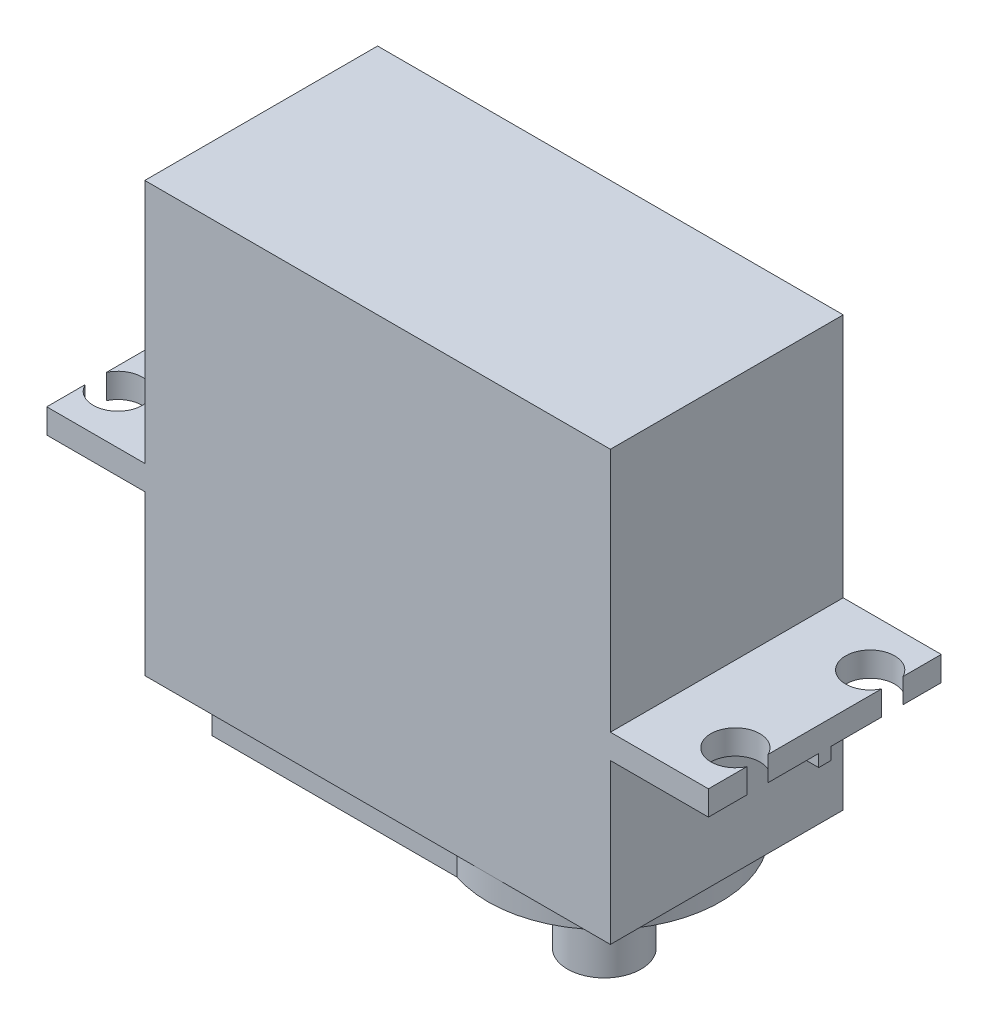
ISO-10303-21;
HEADER;
FILE_DESCRIPTION(('STEP AP214'),'2;1');
FILE_NAME('part.step','',(''),(''),'','','');
FILE_SCHEMA(('AUTOMOTIVE_DESIGN { 1 0 10303 214 1 1 1 1 }'));
ENDSEC;
DATA;
#1=APPLICATION_CONTEXT('core data for automotive mechanical design processes');
#2=APPLICATION_PROTOCOL_DEFINITION('international standard','automotive_design',2000,#1);
#3=PRODUCT_CONTEXT('',#1,'mechanical');
#4=PRODUCT('Part','Part','',(#3));
#5=PRODUCT_RELATED_PRODUCT_CATEGORY('part','',(#4));
#6=PRODUCT_DEFINITION_FORMATION('','',#4);
#7=PRODUCT_DEFINITION_CONTEXT('part definition',#1,'design');
#8=PRODUCT_DEFINITION('design','',#6,#7);
#9=PRODUCT_DEFINITION_SHAPE('','',#8);
#10=(LENGTH_UNIT() NAMED_UNIT(*) SI_UNIT(.MILLI.,.METRE.));
#11=(NAMED_UNIT(*) PLANE_ANGLE_UNIT() SI_UNIT($,.RADIAN.));
#12=(NAMED_UNIT(*) SI_UNIT($,.STERADIAN.) SOLID_ANGLE_UNIT());
#13=UNCERTAINTY_MEASURE_WITH_UNIT(LENGTH_MEASURE(1.E-05),#10,'distance_accuracy_value','');
#14=(GEOMETRIC_REPRESENTATION_CONTEXT(3) GLOBAL_UNCERTAINTY_ASSIGNED_CONTEXT((#13)) GLOBAL_UNIT_ASSIGNED_CONTEXT((#10,
#11,#12)) REPRESENTATION_CONTEXT('',''));
#15=CARTESIAN_POINT('',(0.,0.,0.));
#16=DIRECTION('',(0.,0.,1.));
#17=DIRECTION('',(1.,0.,0.));
#18=AXIS2_PLACEMENT_3D('',#15,#16,#17);
#19=CARTESIAN_POINT('',(9.,-10.,9.5));
#20=DIRECTION('',(0.,1.,0.));
#21=DIRECTION('',(0.,0.,1.));
#22=AXIS2_PLACEMENT_3D('',#19,#20,#21);
#23=CYLINDRICAL_SURFACE('',#22,3.);
#24=CARTESIAN_POINT('',(9.,-10.,9.5));
#25=DIRECTION('',(0.,-1.,0.));
#26=DIRECTION('',(0.,0.,-1.));
#27=AXIS2_PLACEMENT_3D('',#24,#25,#26);
#28=CIRCLE('',#27,3.);
#29=CARTESIAN_POINT('',(9.,-10.,6.5));
#30=VERTEX_POINT('',#29);
#31=EDGE_CURVE('E11',#30,#30,#28,.T.);
#32=ORIENTED_EDGE('',*,*,#31,.F.);
#33=EDGE_LOOP('',(#32));
#34=FACE_BOUND('',#33,.T.);
#35=CARTESIAN_POINT('',(9.,-2.,9.5));
#36=DIRECTION('',(0.,-1.,0.));
#37=DIRECTION('',(0.,0.,-1.));
#38=AXIS2_PLACEMENT_3D('',#35,#36,#37);
#39=CIRCLE('',#38,3.);
#40=CARTESIAN_POINT('',(9.,-2.,6.5));
#41=VERTEX_POINT('',#40);
#42=EDGE_CURVE('E52',#41,#41,#39,.T.);
#43=ORIENTED_EDGE('',*,*,#42,.T.);
#44=EDGE_LOOP('',(#43));
#45=FACE_BOUND('',#44,.T.);
#46=ADVANCED_FACE('F49',(#34,#45),#23,.T.);
#47=CARTESIAN_POINT('',(9.,-10.,9.5));
#48=DIRECTION('',(0.,-1.,0.));
#49=DIRECTION('',(0.,0.,-1.));
#50=AXIS2_PLACEMENT_3D('',#47,#48,#49);
#51=PLANE('',#50);
#52=ORIENTED_EDGE('',*,*,#31,.T.);
#53=EDGE_LOOP('',(#52));
#54=FACE_BOUND('',#53,.T.);
#55=ADVANCED_FACE('F64',(#54),#51,.T.);
#56=CARTESIAN_POINT('',(9.,-2.,9.5));
#57=DIRECTION('',(0.,-1.,0.));
#58=DIRECTION('',(0.,0.,-1.));
#59=AXIS2_PLACEMENT_3D('',#56,#57,#58);
#60=PLANE('',#59);
#61=ORIENTED_EDGE('',*,*,#42,.F.);
#62=EDGE_LOOP('',(#61));
#63=FACE_BOUND('',#62,.T.);
#64=ADVANCED_FACE('F62',(#63),#60,.F.);
#65=CLOSED_SHELL('',(#46,#55,#64));
#66=MANIFOLD_SOLID_BREP('B2',#65);
#67=CARTESIAN_POINT('',(19.,0.,19.));
#68=DIRECTION('',(0.,1.,0.));
#69=DIRECTION('',(0.,0.,1.));
#70=AXIS2_PLACEMENT_3D('',#67,#68,#69);
#71=PLANE('',#70);
#72=DIRECTION('',(1.,0.,0.));
#73=VECTOR('',#72,1.);
#74=CARTESIAN_POINT('',(19.,0.,0.));
#75=LINE('',#74,#73);
#76=CARTESIAN_POINT('',(-19.,0.,0.));
#77=VERTEX_POINT('',#76);
#78=CARTESIAN_POINT('',(19.,0.,0.));
#79=VERTEX_POINT('',#78);
#80=EDGE_CURVE('E513',#77,#79,#75,.T.);
#81=ORIENTED_EDGE('',*,*,#80,.T.);
#82=DIRECTION('',(0.,0.,-1.));
#83=VECTOR('',#82,1.);
#84=CARTESIAN_POINT('',(19.,0.,19.));
#85=LINE('',#84,#83);
#86=CARTESIAN_POINT('',(19.,0.,19.));
#87=VERTEX_POINT('',#86);
#88=EDGE_CURVE('E564',#87,#79,#85,.T.);
#89=ORIENTED_EDGE('',*,*,#88,.F.);
#90=DIRECTION('',(1.,0.,0.));
#91=VECTOR('',#90,1.);
#92=CARTESIAN_POINT('',(19.,0.,19.));
#93=LINE('',#92,#91);
#94=CARTESIAN_POINT('',(-19.,0.,19.));
#95=VERTEX_POINT('',#94);
#96=EDGE_CURVE('E473',#95,#87,#93,.T.);
#97=ORIENTED_EDGE('',*,*,#96,.F.);
#98=DIRECTION('',(0.,0.,-1.));
#99=VECTOR('',#98,1.);
#100=CARTESIAN_POINT('',(-19.,0.,19.));
#101=LINE('',#100,#99);
#102=EDGE_CURVE('E568',#95,#77,#101,.T.);
#103=ORIENTED_EDGE('',*,*,#102,.T.);
#104=EDGE_LOOP('',(#81,#89,#97,#103));
#105=FACE_BOUND('',#104,.T.);
#106=DIRECTION('',(0.,0.,-1.));
#107=VECTOR('',#106,1.);
#108=CARTESIAN_POINT('',(-14.,0.,18.5));
#109=LINE('',#108,#107);
#110=CARTESIAN_POINT('',(-14.,0.,18.5));
#111=VERTEX_POINT('',#110);
#112=CARTESIAN_POINT('',(-14.,0.,0.5));
#113=VERTEX_POINT('',#112);
#114=EDGE_CURVE('E322',#111,#113,#109,.T.);
#115=ORIENTED_EDGE('',*,*,#114,.F.);
#116=DIRECTION('',(-1.,0.,0.));
#117=VECTOR('',#116,1.);
#118=CARTESIAN_POINT('',(-14.,0.,18.5));
#119=LINE('',#118,#117);
#120=CARTESIAN_POINT('',(6.,0.,18.5));
#121=VERTEX_POINT('',#120);
#122=EDGE_CURVE('E319',#121,#111,#119,.T.);
#123=ORIENTED_EDGE('',*,*,#122,.F.);
#124=CARTESIAN_POINT('',(9.,0.,9.5));
#125=DIRECTION('',(0.,-1.,0.));
#126=DIRECTION('',(0.,0.,1.));
#127=AXIS2_PLACEMENT_3D('',#124,#125,#126);
#128=CIRCLE('',#127,9.48683298050514);
#129=CARTESIAN_POINT('',(6.,0.,0.5));
#130=VERTEX_POINT('',#129);
#131=EDGE_CURVE('E111',#130,#121,#128,.T.);
#132=ORIENTED_EDGE('',*,*,#131,.F.);
#133=DIRECTION('',(1.,0.,0.));
#134=VECTOR('',#133,1.);
#135=CARTESIAN_POINT('',(-14.,0.,0.5));
#136=LINE('',#135,#134);
#137=EDGE_CURVE('E106',#113,#130,#136,.T.);
#138=ORIENTED_EDGE('',*,*,#137,.F.);
#139=EDGE_LOOP('',(#115,#123,#132,#138));
#140=FACE_BOUND('',#139,.T.);
#141=ADVANCED_FACE('F90',(#105,#140),#71,.F.);
#142=CARTESIAN_POINT('',(19.,0.,19.));
#143=DIRECTION('',(-1.,0.,0.));
#144=DIRECTION('',(0.,0.,1.));
#145=AXIS2_PLACEMENT_3D('',#142,#143,#144);
#146=PLANE('',#145);
#147=DIRECTION('',(0.,1.,0.));
#148=VECTOR('',#147,1.);
#149=CARTESIAN_POINT('',(19.,12.,8.99999999999999));
#150=LINE('',#149,#148);
#151=CARTESIAN_POINT('',(19.,12.,8.99999999999999));
#152=VERTEX_POINT('',#151);
#153=CARTESIAN_POINT('',(19.,13.,8.99999999999999));
#154=VERTEX_POINT('',#153);
#155=EDGE_CURVE('E364',#152,#154,#150,.T.);
#156=ORIENTED_EDGE('',*,*,#155,.F.);
#157=DIRECTION('',(0.,0.,-1.));
#158=VECTOR('',#157,1.);
#159=CARTESIAN_POINT('',(19.,12.,9.99999999999999));
#160=LINE('',#159,#158);
#161=CARTESIAN_POINT('',(19.,12.,9.99999999999999));
#162=VERTEX_POINT('',#161);
#163=EDGE_CURVE('E335',#162,#152,#160,.T.);
#164=ORIENTED_EDGE('',*,*,#163,.F.);
#165=DIRECTION('',(0.,1.,0.));
#166=VECTOR('',#165,1.);
#167=CARTESIAN_POINT('',(19.,12.,9.99999999999999));
#168=LINE('',#167,#166);
#169=CARTESIAN_POINT('',(19.,13.,9.99999999999999));
#170=VERTEX_POINT('',#169);
#171=EDGE_CURVE('E348',#162,#170,#168,.T.);
#172=ORIENTED_EDGE('',*,*,#171,.T.);
#173=DIRECTION('',(0.,0.,-1.));
#174=VECTOR('',#173,1.);
#175=CARTESIAN_POINT('',(19.,13.,19.));
#176=LINE('',#175,#174);
#177=CARTESIAN_POINT('',(19.,13.,19.));
#178=VERTEX_POINT('',#177);
#179=EDGE_CURVE('E561',#178,#170,#176,.T.);
#180=ORIENTED_EDGE('',*,*,#179,.F.);
#181=DIRECTION('',(0.,1.,0.));
#182=VECTOR('',#181,1.);
#183=CARTESIAN_POINT('',(19.,0.,19.));
#184=LINE('',#183,#182);
#185=EDGE_CURVE('E476',#87,#178,#184,.T.);
#186=ORIENTED_EDGE('',*,*,#185,.F.);
#187=ORIENTED_EDGE('',*,*,#88,.T.);
#188=DIRECTION('',(0.,1.,0.));
#189=VECTOR('',#188,1.);
#190=CARTESIAN_POINT('',(19.,0.,0.));
#191=LINE('',#190,#189);
#192=CARTESIAN_POINT('',(19.,13.,0.));
#193=VERTEX_POINT('',#192);
#194=EDGE_CURVE('E516',#79,#193,#191,.T.);
#195=ORIENTED_EDGE('',*,*,#194,.T.);
#196=EDGE_CURVE('E558',#154,#193,#176,.T.);
#197=ORIENTED_EDGE('',*,*,#196,.F.);
#198=EDGE_LOOP('',(#156,#164,#172,#180,#186,#187,#195,#197));
#199=FACE_BOUND('',#198,.T.);
#200=ADVANCED_FACE('F697',(#199),#146,.F.);
#201=CARTESIAN_POINT('',(19.,13.,19.));
#202=DIRECTION('',(0.,1.,0.));
#203=DIRECTION('',(-1.,0.,0.));
#204=AXIS2_PLACEMENT_3D('',#201,#202,#203);
#205=PLANE('',#204);
#206=DIRECTION('',(1.,0.,0.));
#207=VECTOR('',#206,1.);
#208=CARTESIAN_POINT('',(19.,13.,8.99999999999999));
#209=LINE('',#208,#207);
#210=CARTESIAN_POINT('',(27.,13.,8.99999999999999));
#211=VERTEX_POINT('',#210);
#212=EDGE_CURVE('E324',#154,#211,#209,.T.);
#213=ORIENTED_EDGE('',*,*,#212,.F.);
#214=ORIENTED_EDGE('',*,*,#196,.T.);
#215=DIRECTION('',(1.,0.,0.));
#216=VECTOR('',#215,1.);
#217=CARTESIAN_POINT('',(19.,13.,0.));
#218=LINE('',#217,#216);
#219=CARTESIAN_POINT('',(27.,13.,0.));
#220=VERTEX_POINT('',#219);
#221=EDGE_CURVE('E520',#193,#220,#218,.T.);
#222=ORIENTED_EDGE('',*,*,#221,.T.);
#223=DIRECTION('',(0.,0.,-1.));
#224=VECTOR('',#223,1.);
#225=CARTESIAN_POINT('',(27.,13.,19.));
#226=LINE('',#225,#224);
#227=CARTESIAN_POINT('',(27.,13.,3.12822021129187));
#228=VERTEX_POINT('',#227);
#229=EDGE_CURVE('E552',#228,#220,#226,.T.);
#230=ORIENTED_EDGE('',*,*,#229,.F.);
#231=CARTESIAN_POINT('',(25.2,13.,4.));
#232=DIRECTION('',(0.,1.,0.));
#233=DIRECTION('',(-1.,0.,0.));
#234=AXIS2_PLACEMENT_3D('',#231,#232,#233);
#235=CIRCLE('',#234,2.);
#236=CARTESIAN_POINT('',(27.,13.,4.87177978870814));
#237=VERTEX_POINT('',#236);
#238=EDGE_CURVE('E419',#228,#237,#235,.T.);
#239=ORIENTED_EDGE('',*,*,#238,.T.);
#240=EDGE_CURVE('E560',#211,#237,#226,.T.);
#241=ORIENTED_EDGE('',*,*,#240,.F.);
#242=EDGE_LOOP('',(#213,#214,#222,#230,#239,#241));
#243=FACE_BOUND('',#242,.T.);
#244=ADVANCED_FACE('F693',(#243),#205,.F.);
#245=DIRECTION('',(-1.,0.,0.));
#246=VECTOR('',#245,1.);
#247=CARTESIAN_POINT('',(19.,13.,9.99999999999999));
#248=LINE('',#247,#246);
#249=CARTESIAN_POINT('',(27.,13.,9.99999999999999));
#250=VERTEX_POINT('',#249);
#251=EDGE_CURVE('E329',#250,#170,#248,.T.);
#252=ORIENTED_EDGE('',*,*,#251,.F.);
#253=CARTESIAN_POINT('',(27.,13.,14.1282202112919));
#254=VERTEX_POINT('',#253);
#255=EDGE_CURVE('E559',#254,#250,#226,.T.);
#256=ORIENTED_EDGE('',*,*,#255,.F.);
#257=CARTESIAN_POINT('',(25.2,13.,15.));
#258=DIRECTION('',(0.,1.,0.));
#259=DIRECTION('',(-1.,0.,0.));
#260=AXIS2_PLACEMENT_3D('',#257,#258,#259);
#261=CIRCLE('',#260,2.);
#262=CARTESIAN_POINT('',(27.,13.,15.8717797887081));
#263=VERTEX_POINT('',#262);
#264=EDGE_CURVE('E447',#254,#263,#261,.T.);
#265=ORIENTED_EDGE('',*,*,#264,.T.);
#266=CARTESIAN_POINT('',(27.,13.,19.));
#267=VERTEX_POINT('',#266);
#268=EDGE_CURVE('E554',#267,#263,#226,.T.);
#269=ORIENTED_EDGE('',*,*,#268,.F.);
#270=DIRECTION('',(1.,0.,0.));
#271=VECTOR('',#270,1.);
#272=CARTESIAN_POINT('',(19.,13.,19.));
#273=LINE('',#272,#271);
#274=EDGE_CURVE('E479',#178,#267,#273,.T.);
#275=ORIENTED_EDGE('',*,*,#274,.F.);
#276=ORIENTED_EDGE('',*,*,#179,.T.);
#277=EDGE_LOOP('',(#252,#256,#265,#269,#275,#276));
#278=FACE_BOUND('',#277,.T.);
#279=ADVANCED_FACE('F702',(#278),#205,.F.);
#280=CARTESIAN_POINT('',(-19.,13.,19.));
#281=DIRECTION('',(0.,1.,0.));
#282=DIRECTION('',(-1.,0.,0.));
#283=AXIS2_PLACEMENT_3D('',#280,#281,#282);
#284=PLANE('',#283);
#285=DIRECTION('',(-1.,0.,0.));
#286=VECTOR('',#285,1.);
#287=CARTESIAN_POINT('',(-19.,13.,10.));
#288=LINE('',#287,#286);
#289=CARTESIAN_POINT('',(-19.,13.,10.));
#290=VERTEX_POINT('',#289);
#291=CARTESIAN_POINT('',(-27.,13.,10.));
#292=VERTEX_POINT('',#291);
#293=EDGE_CURVE('E368',#290,#292,#288,.T.);
#294=ORIENTED_EDGE('',*,*,#293,.F.);
#295=DIRECTION('',(0.,0.,-1.));
#296=VECTOR('',#295,1.);
#297=CARTESIAN_POINT('',(-19.,13.,19.));
#298=LINE('',#297,#296);
#299=CARTESIAN_POINT('',(-19.,13.,19.));
#300=VERTEX_POINT('',#299);
#301=EDGE_CURVE('E573',#300,#290,#298,.T.);
#302=ORIENTED_EDGE('',*,*,#301,.F.);
#303=DIRECTION('',(1.,0.,0.));
#304=VECTOR('',#303,1.);
#305=CARTESIAN_POINT('',(-19.,13.,19.));
#306=LINE('',#305,#304);
#307=CARTESIAN_POINT('',(-27.,13.,19.));
#308=VERTEX_POINT('',#307);
#309=EDGE_CURVE('E467',#308,#300,#306,.T.);
#310=ORIENTED_EDGE('',*,*,#309,.F.);
#311=DIRECTION('',(0.,0.,-1.));
#312=VECTOR('',#311,1.);
#313=CARTESIAN_POINT('',(-27.,13.,19.));
#314=LINE('',#313,#312);
#315=CARTESIAN_POINT('',(-27.,13.,15.8717797887081));
#316=VERTEX_POINT('',#315);
#317=EDGE_CURVE('E578',#308,#316,#314,.T.);
#318=ORIENTED_EDGE('',*,*,#317,.T.);
#319=CARTESIAN_POINT('',(-25.2,13.,15.));
#320=DIRECTION('',(0.,1.,0.));
#321=DIRECTION('',(-1.,0.,0.));
#322=AXIS2_PLACEMENT_3D('',#319,#320,#321);
#323=CIRCLE('',#322,2.);
#324=CARTESIAN_POINT('',(-27.,13.,14.1282202112919));
#325=VERTEX_POINT('',#324);
#326=EDGE_CURVE('E99',#316,#325,#323,.T.);
#327=ORIENTED_EDGE('',*,*,#326,.T.);
#328=EDGE_CURVE('E583',#325,#292,#314,.T.);
#329=ORIENTED_EDGE('',*,*,#328,.T.);
#330=EDGE_LOOP('',(#294,#302,#310,#318,#327,#329));
#331=FACE_BOUND('',#330,.T.);
#332=ADVANCED_FACE('F601',(#331),#284,.F.);
#333=DIRECTION('',(1.,0.,0.));
#334=VECTOR('',#333,1.);
#335=CARTESIAN_POINT('',(-19.,13.,9.));
#336=LINE('',#335,#334);
#337=CARTESIAN_POINT('',(-27.,13.,9.));
#338=VERTEX_POINT('',#337);
#339=CARTESIAN_POINT('',(-19.,13.,9.));
#340=VERTEX_POINT('',#339);
#341=EDGE_CURVE('E374',#338,#340,#336,.T.);
#342=ORIENTED_EDGE('',*,*,#341,.F.);
#343=CARTESIAN_POINT('',(-27.,13.,4.87177978870813));
#344=VERTEX_POINT('',#343);
#345=EDGE_CURVE('E584',#338,#344,#314,.T.);
#346=ORIENTED_EDGE('',*,*,#345,.T.);
#347=CARTESIAN_POINT('',(-25.2,13.,4.));
#348=DIRECTION('',(0.,1.,0.));
#349=DIRECTION('',(-1.,0.,0.));
#350=AXIS2_PLACEMENT_3D('',#347,#348,#349);
#351=CIRCLE('',#350,2.);
#352=CARTESIAN_POINT('',(-27.,13.,3.12822021129187));
#353=VERTEX_POINT('',#352);
#354=EDGE_CURVE('E47',#344,#353,#351,.T.);
#355=ORIENTED_EDGE('',*,*,#354,.T.);
#356=CARTESIAN_POINT('',(-27.,13.,0.));
#357=VERTEX_POINT('',#356);
#358=EDGE_CURVE('E577',#353,#357,#314,.T.);
#359=ORIENTED_EDGE('',*,*,#358,.T.);
#360=DIRECTION('',(1.,0.,0.));
#361=VECTOR('',#360,1.);
#362=CARTESIAN_POINT('',(-19.,13.,0.));
#363=LINE('',#362,#361);
#364=CARTESIAN_POINT('',(-19.,13.,0.));
#365=VERTEX_POINT('',#364);
#366=EDGE_CURVE('E506',#357,#365,#363,.T.);
#367=ORIENTED_EDGE('',*,*,#366,.T.);
#368=EDGE_CURVE('E572',#340,#365,#298,.T.);
#369=ORIENTED_EDGE('',*,*,#368,.F.);
#370=EDGE_LOOP('',(#342,#346,#355,#359,#367,#369));
#371=FACE_BOUND('',#370,.T.);
#372=ADVANCED_FACE('F615',(#371),#284,.F.);
#373=CARTESIAN_POINT('',(-19.,0.,19.));
#374=DIRECTION('',(1.,0.,0.));
#375=DIRECTION('',(0.,0.,-1.));
#376=AXIS2_PLACEMENT_3D('',#373,#374,#375);
#377=PLANE('',#376);
#378=DIRECTION('',(0.,1.,0.));
#379=VECTOR('',#378,1.);
#380=CARTESIAN_POINT('',(-19.,12.,10.));
#381=LINE('',#380,#379);
#382=CARTESIAN_POINT('',(-19.,12.,10.));
#383=VERTEX_POINT('',#382);
#384=EDGE_CURVE('E385',#383,#290,#381,.T.);
#385=ORIENTED_EDGE('',*,*,#384,.F.);
#386=DIRECTION('',(0.,0.,1.));
#387=VECTOR('',#386,1.);
#388=CARTESIAN_POINT('',(-19.,12.,10.));
#389=LINE('',#388,#387);
#390=CARTESIAN_POINT('',(-19.,12.,9.));
#391=VERTEX_POINT('',#390);
#392=EDGE_CURVE('E381',#391,#383,#389,.T.);
#393=ORIENTED_EDGE('',*,*,#392,.F.);
#394=DIRECTION('',(0.,1.,0.));
#395=VECTOR('',#394,1.);
#396=CARTESIAN_POINT('',(-19.,12.,9.));
#397=LINE('',#396,#395);
#398=EDGE_CURVE('E395',#391,#340,#397,.T.);
#399=ORIENTED_EDGE('',*,*,#398,.T.);
#400=ORIENTED_EDGE('',*,*,#368,.T.);
#401=DIRECTION('',(0.,-1.,0.));
#402=VECTOR('',#401,1.);
#403=CARTESIAN_POINT('',(-19.,0.,0.));
#404=LINE('',#403,#402);
#405=EDGE_CURVE('E510',#365,#77,#404,.T.);
#406=ORIENTED_EDGE('',*,*,#405,.T.);
#407=ORIENTED_EDGE('',*,*,#102,.F.);
#408=DIRECTION('',(0.,-1.,0.));
#409=VECTOR('',#408,1.);
#410=CARTESIAN_POINT('',(-19.,0.,19.));
#411=LINE('',#410,#409);
#412=EDGE_CURVE('E470',#300,#95,#411,.T.);
#413=ORIENTED_EDGE('',*,*,#412,.F.);
#414=ORIENTED_EDGE('',*,*,#301,.T.);
#415=EDGE_LOOP('',(#385,#393,#399,#400,#406,#407,#413,#414));
#416=FACE_BOUND('',#415,.T.);
#417=ADVANCED_FACE('F631',(#416),#377,.F.);
#418=CARTESIAN_POINT('',(-27.,13.,19.));
#419=DIRECTION('',(1.,0.,0.));
#420=DIRECTION('',(0.,0.,-1.));
#421=AXIS2_PLACEMENT_3D('',#418,#419,#420);
#422=PLANE('',#421);
#423=ORIENTED_EDGE('',*,*,#358,.F.);
#424=DIRECTION('',(0.,1.,0.));
#425=VECTOR('',#424,1.);
#426=CARTESIAN_POINT('',(-27.,0.,3.12822021129187));
#427=LINE('',#426,#425);
#428=CARTESIAN_POINT('',(-27.,15.,3.12822021129187));
#429=VERTEX_POINT('',#428);
#430=EDGE_CURVE('E439',#353,#429,#427,.T.);
#431=ORIENTED_EDGE('',*,*,#430,.T.);
#432=DIRECTION('',(0.,0.,-1.));
#433=VECTOR('',#432,1.);
#434=CARTESIAN_POINT('',(-27.,15.,19.));
#435=LINE('',#434,#433);
#436=CARTESIAN_POINT('',(-27.,15.,0.));
#437=VERTEX_POINT('',#436);
#438=EDGE_CURVE('E582',#429,#437,#435,.T.);
#439=ORIENTED_EDGE('',*,*,#438,.T.);
#440=DIRECTION('',(0.,-1.,0.));
#441=VECTOR('',#440,1.);
#442=CARTESIAN_POINT('',(-27.,13.,0.));
#443=LINE('',#442,#441);
#444=EDGE_CURVE('E502',#437,#357,#443,.T.);
#445=ORIENTED_EDGE('',*,*,#444,.T.);
#446=EDGE_LOOP('',(#423,#431,#439,#445));
#447=FACE_BOUND('',#446,.T.);
#448=ADVANCED_FACE('F622',(#447),#422,.F.);
#449=CARTESIAN_POINT('',(-27.,15.,14.1282202112919));
#450=VERTEX_POINT('',#449);
#451=CARTESIAN_POINT('',(-27.,15.,4.87177978870813));
#452=VERTEX_POINT('',#451);
#453=EDGE_CURVE('E590',#450,#452,#435,.T.);
#454=ORIENTED_EDGE('',*,*,#453,.T.);
#455=DIRECTION('',(0.,1.,0.));
#456=VECTOR('',#455,1.);
#457=CARTESIAN_POINT('',(-27.,0.,4.87177978870814));
#458=LINE('',#457,#456);
#459=EDGE_CURVE('E435',#452,#344,#458,.F.);
#460=ORIENTED_EDGE('',*,*,#459,.T.);
#461=ORIENTED_EDGE('',*,*,#345,.F.);
#462=DIRECTION('',(0.,1.,0.));
#463=VECTOR('',#462,1.);
#464=CARTESIAN_POINT('',(-27.,12.,9.));
#465=LINE('',#464,#463);
#466=CARTESIAN_POINT('',(-27.,12.,9.));
#467=VERTEX_POINT('',#466);
#468=EDGE_CURVE('E398',#467,#338,#465,.T.);
#469=ORIENTED_EDGE('',*,*,#468,.F.);
#470=DIRECTION('',(0.,0.,-1.));
#471=VECTOR('',#470,1.);
#472=CARTESIAN_POINT('',(-27.,12.,9.));
#473=LINE('',#472,#471);
#474=CARTESIAN_POINT('',(-27.,12.,10.));
#475=VERTEX_POINT('',#474);
#476=EDGE_CURVE('E373',#475,#467,#473,.T.);
#477=ORIENTED_EDGE('',*,*,#476,.F.);
#478=DIRECTION('',(0.,1.,0.));
#479=VECTOR('',#478,1.);
#480=CARTESIAN_POINT('',(-27.,12.,10.));
#481=LINE('',#480,#479);
#482=EDGE_CURVE('E402',#475,#292,#481,.T.);
#483=ORIENTED_EDGE('',*,*,#482,.T.);
#484=ORIENTED_EDGE('',*,*,#328,.F.);
#485=DIRECTION('',(0.,1.,0.));
#486=VECTOR('',#485,1.);
#487=CARTESIAN_POINT('',(-27.,0.,14.1282202112919));
#488=LINE('',#487,#486);
#489=EDGE_CURVE('E431',#325,#450,#488,.T.);
#490=ORIENTED_EDGE('',*,*,#489,.T.);
#491=EDGE_LOOP('',(#454,#460,#461,#469,#477,#483,#484,#490));
#492=FACE_BOUND('',#491,.T.);
#493=ADVANCED_FACE('F607',(#492),#422,.F.);
#494=CARTESIAN_POINT('',(27.,13.,19.));
#495=DIRECTION('',(-1.,0.,0.));
#496=DIRECTION('',(0.,0.,1.));
#497=AXIS2_PLACEMENT_3D('',#494,#495,#496);
#498=PLANE('',#497);
#499=ORIENTED_EDGE('',*,*,#255,.T.);
#500=DIRECTION('',(0.,1.,0.));
#501=VECTOR('',#500,1.);
#502=CARTESIAN_POINT('',(27.,12.,9.99999999999999));
#503=LINE('',#502,#501);
#504=CARTESIAN_POINT('',(27.,12.,9.99999999999999));
#505=VERTEX_POINT('',#504);
#506=EDGE_CURVE('E356',#505,#250,#503,.T.);
#507=ORIENTED_EDGE('',*,*,#506,.F.);
#508=DIRECTION('',(0.,0.,1.));
#509=VECTOR('',#508,1.);
#510=CARTESIAN_POINT('',(27.,12.,8.99999999999999));
#511=LINE('',#510,#509);
#512=CARTESIAN_POINT('',(27.,12.,8.99999999999999));
#513=VERTEX_POINT('',#512);
#514=EDGE_CURVE('E342',#513,#505,#511,.T.);
#515=ORIENTED_EDGE('',*,*,#514,.F.);
#516=DIRECTION('',(0.,1.,0.));
#517=VECTOR('',#516,1.);
#518=CARTESIAN_POINT('',(27.,12.,8.99999999999999));
#519=LINE('',#518,#517);
#520=EDGE_CURVE('E360',#513,#211,#519,.T.);
#521=ORIENTED_EDGE('',*,*,#520,.T.);
#522=ORIENTED_EDGE('',*,*,#240,.T.);
#523=DIRECTION('',(0.,1.,0.));
#524=VECTOR('',#523,1.);
#525=CARTESIAN_POINT('',(27.,0.,4.87177978870814));
#526=LINE('',#525,#524);
#527=CARTESIAN_POINT('',(27.,15.,4.87177978870814));
#528=VERTEX_POINT('',#527);
#529=EDGE_CURVE('E423',#237,#528,#526,.T.);
#530=ORIENTED_EDGE('',*,*,#529,.T.);
#531=DIRECTION('',(0.,0.,-1.));
#532=VECTOR('',#531,1.);
#533=CARTESIAN_POINT('',(27.,15.,19.));
#534=LINE('',#533,#532);
#535=CARTESIAN_POINT('',(27.,15.,14.1282202112919));
#536=VERTEX_POINT('',#535);
#537=EDGE_CURVE('E553',#536,#528,#534,.T.);
#538=ORIENTED_EDGE('',*,*,#537,.F.);
#539=DIRECTION('',(0.,1.,0.));
#540=VECTOR('',#539,1.);
#541=CARTESIAN_POINT('',(27.,0.,14.1282202112919));
#542=LINE('',#541,#540);
#543=EDGE_CURVE('E443',#536,#254,#542,.F.);
#544=ORIENTED_EDGE('',*,*,#543,.T.);
#545=EDGE_LOOP('',(#499,#507,#515,#521,#522,#530,#538,#544));
#546=FACE_BOUND('',#545,.T.);
#547=ADVANCED_FACE('F711',(#546),#498,.F.);
#548=ORIENTED_EDGE('',*,*,#268,.T.);
#549=DIRECTION('',(0.,1.,0.));
#550=VECTOR('',#549,1.);
#551=CARTESIAN_POINT('',(27.,0.,15.8717797887081));
#552=LINE('',#551,#550);
#553=CARTESIAN_POINT('',(27.,15.,15.8717797887081));
#554=VERTEX_POINT('',#553);
#555=EDGE_CURVE('E451',#263,#554,#552,.T.);
#556=ORIENTED_EDGE('',*,*,#555,.T.);
#557=CARTESIAN_POINT('',(27.,15.,19.));
#558=VERTEX_POINT('',#557);
#559=EDGE_CURVE('E548',#558,#554,#534,.T.);
#560=ORIENTED_EDGE('',*,*,#559,.F.);
#561=DIRECTION('',(0.,1.,0.));
#562=VECTOR('',#561,1.);
#563=CARTESIAN_POINT('',(27.,13.,19.));
#564=LINE('',#563,#562);
#565=EDGE_CURVE('E482',#267,#558,#564,.T.);
#566=ORIENTED_EDGE('',*,*,#565,.F.);
#567=EDGE_LOOP('',(#548,#556,#560,#566));
#568=FACE_BOUND('',#567,.T.);
#569=ADVANCED_FACE('F706',(#568),#498,.F.);
#570=CARTESIAN_POINT('',(-19.,15.,19.));
#571=DIRECTION('',(1.,0.,0.));
#572=DIRECTION('',(0.,0.,-1.));
#573=AXIS2_PLACEMENT_3D('',#570,#571,#572);
#574=PLANE('',#573);
#575=DIRECTION('',(0.,-1.,0.));
#576=VECTOR('',#575,1.);
#577=CARTESIAN_POINT('',(-19.,15.,0.));
#578=LINE('',#577,#576);
#579=CARTESIAN_POINT('',(-19.,35.,0.));
#580=VERTEX_POINT('',#579);
#581=CARTESIAN_POINT('',(-19.,15.,0.));
#582=VERTEX_POINT('',#581);
#583=EDGE_CURVE('E455',#580,#582,#578,.T.);
#584=ORIENTED_EDGE('',*,*,#583,.T.);
#585=DIRECTION('',(0.,0.,-1.));
#586=VECTOR('',#585,1.);
#587=CARTESIAN_POINT('',(-19.,15.,19.));
#588=LINE('',#587,#586);
#589=CARTESIAN_POINT('',(-19.,15.,19.));
#590=VERTEX_POINT('',#589);
#591=EDGE_CURVE('E589',#590,#582,#588,.T.);
#592=ORIENTED_EDGE('',*,*,#591,.F.);
#593=DIRECTION('',(0.,-1.,0.));
#594=VECTOR('',#593,1.);
#595=CARTESIAN_POINT('',(-19.,15.,19.));
#596=LINE('',#595,#594);
#597=CARTESIAN_POINT('',(-19.,35.,19.));
#598=VERTEX_POINT('',#597);
#599=EDGE_CURVE('E456',#598,#590,#596,.T.);
#600=ORIENTED_EDGE('',*,*,#599,.F.);
#601=DIRECTION('',(0.,0.,-1.));
#602=VECTOR('',#601,1.);
#603=CARTESIAN_POINT('',(-19.,35.,19.));
#604=LINE('',#603,#602);
#605=EDGE_CURVE('E494',#598,#580,#604,.T.);
#606=ORIENTED_EDGE('',*,*,#605,.T.);
#607=EDGE_LOOP('',(#584,#592,#600,#606));
#608=FACE_BOUND('',#607,.T.);
#609=ADVANCED_FACE('F92',(#608),#574,.F.);
#610=CARTESIAN_POINT('',(-27.,15.,19.));
#611=DIRECTION('',(0.,-1.,0.));
#612=DIRECTION('',(1.,0.,0.));
#613=AXIS2_PLACEMENT_3D('',#610,#611,#612);
#614=PLANE('',#613);
#615=ORIENTED_EDGE('',*,*,#438,.F.);
#616=CARTESIAN_POINT('',(-25.2,15.,4.));
#617=DIRECTION('',(0.,1.,0.));
#618=DIRECTION('',(-1.,0.,0.));
#619=AXIS2_PLACEMENT_3D('',#616,#617,#618);
#620=CIRCLE('',#619,2.);
#621=EDGE_CURVE('E411',#452,#429,#620,.T.);
#622=ORIENTED_EDGE('',*,*,#621,.F.);
#623=ORIENTED_EDGE('',*,*,#453,.F.);
#624=CARTESIAN_POINT('',(-25.2,15.,15.));
#625=DIRECTION('',(0.,1.,0.));
#626=DIRECTION('',(1.,0.,0.));
#627=AXIS2_PLACEMENT_3D('',#624,#625,#626);
#628=CIRCLE('',#627,2.);
#629=CARTESIAN_POINT('',(-27.,15.,15.8717797887081));
#630=VERTEX_POINT('',#629);
#631=EDGE_CURVE('E406',#630,#450,#628,.T.);
#632=ORIENTED_EDGE('',*,*,#631,.F.);
#633=CARTESIAN_POINT('',(-27.,15.,19.));
#634=VERTEX_POINT('',#633);
#635=EDGE_CURVE('E585',#634,#630,#435,.T.);
#636=ORIENTED_EDGE('',*,*,#635,.F.);
#637=DIRECTION('',(-1.,0.,0.));
#638=VECTOR('',#637,1.);
#639=CARTESIAN_POINT('',(-27.,15.,19.));
#640=LINE('',#639,#638);
#641=EDGE_CURVE('E460',#590,#634,#640,.T.);
#642=ORIENTED_EDGE('',*,*,#641,.F.);
#643=ORIENTED_EDGE('',*,*,#591,.T.);
#644=DIRECTION('',(-1.,0.,0.));
#645=VECTOR('',#644,1.);
#646=CARTESIAN_POINT('',(-27.,15.,0.));
#647=LINE('',#646,#645);
#648=EDGE_CURVE('E498',#582,#437,#647,.T.);
#649=ORIENTED_EDGE('',*,*,#648,.T.);
#650=EDGE_LOOP('',(#615,#622,#623,#632,#636,#642,#643,#649));
#651=FACE_BOUND('',#650,.T.);
#652=ADVANCED_FACE('F657',(#651),#614,.F.);
#653=ORIENTED_EDGE('',*,*,#635,.T.);
#654=DIRECTION('',(0.,1.,0.));
#655=VECTOR('',#654,1.);
#656=CARTESIAN_POINT('',(-27.,0.,15.8717797887081));
#657=LINE('',#656,#655);
#658=EDGE_CURVE('E427',#630,#316,#657,.F.);
#659=ORIENTED_EDGE('',*,*,#658,.T.);
#660=ORIENTED_EDGE('',*,*,#317,.F.);
#661=DIRECTION('',(0.,-1.,0.));
#662=VECTOR('',#661,1.);
#663=CARTESIAN_POINT('',(-27.,13.,19.));
#664=LINE('',#663,#662);
#665=EDGE_CURVE('E464',#634,#308,#664,.T.);
#666=ORIENTED_EDGE('',*,*,#665,.F.);
#667=EDGE_LOOP('',(#653,#659,#660,#666));
#668=FACE_BOUND('',#667,.T.);
#669=ADVANCED_FACE('F664',(#668),#422,.F.);
#670=CARTESIAN_POINT('',(27.,15.,3.12822021129186));
#671=VERTEX_POINT('',#670);
#672=CARTESIAN_POINT('',(27.,15.,0.));
#673=VERTEX_POINT('',#672);
#674=EDGE_CURVE('E547',#671,#673,#534,.T.);
#675=ORIENTED_EDGE('',*,*,#674,.F.);
#676=DIRECTION('',(0.,1.,0.));
#677=VECTOR('',#676,1.);
#678=CARTESIAN_POINT('',(27.,0.,3.12822021129187));
#679=LINE('',#678,#677);
#680=EDGE_CURVE('E410',#671,#228,#679,.F.);
#681=ORIENTED_EDGE('',*,*,#680,.T.);
#682=ORIENTED_EDGE('',*,*,#229,.T.);
#683=DIRECTION('',(0.,1.,0.));
#684=VECTOR('',#683,1.);
#685=CARTESIAN_POINT('',(27.,13.,0.));
#686=LINE('',#685,#684);
#687=EDGE_CURVE('E524',#220,#673,#686,.T.);
#688=ORIENTED_EDGE('',*,*,#687,.T.);
#689=EDGE_LOOP('',(#675,#681,#682,#688));
#690=FACE_BOUND('',#689,.T.);
#691=ADVANCED_FACE('F689',(#690),#498,.F.);
#692=CARTESIAN_POINT('',(27.,15.,19.));
#693=DIRECTION('',(0.,-1.,0.));
#694=DIRECTION('',(1.,0.,0.));
#695=AXIS2_PLACEMENT_3D('',#692,#693,#694);
#696=PLANE('',#695);
#697=ORIENTED_EDGE('',*,*,#537,.T.);
#698=CARTESIAN_POINT('',(25.2,15.,4.));
#699=DIRECTION('',(0.,1.,0.));
#700=DIRECTION('',(1.,0.,0.));
#701=AXIS2_PLACEMENT_3D('',#698,#699,#700);
#702=CIRCLE('',#701,2.);
#703=EDGE_CURVE('E407',#671,#528,#702,.T.);
#704=ORIENTED_EDGE('',*,*,#703,.F.);
#705=ORIENTED_EDGE('',*,*,#674,.T.);
#706=DIRECTION('',(-1.,0.,0.));
#707=VECTOR('',#706,1.);
#708=CARTESIAN_POINT('',(27.,15.,0.));
#709=LINE('',#708,#707);
#710=CARTESIAN_POINT('',(19.,15.,0.));
#711=VERTEX_POINT('',#710);
#712=EDGE_CURVE('E528',#673,#711,#709,.T.);
#713=ORIENTED_EDGE('',*,*,#712,.T.);
#714=DIRECTION('',(0.,0.,-1.));
#715=VECTOR('',#714,1.);
#716=CARTESIAN_POINT('',(19.,15.,19.));
#717=LINE('',#716,#715);
#718=CARTESIAN_POINT('',(19.,15.,19.));
#719=VERTEX_POINT('',#718);
#720=EDGE_CURVE('E543',#719,#711,#717,.T.);
#721=ORIENTED_EDGE('',*,*,#720,.F.);
#722=DIRECTION('',(-1.,0.,0.));
#723=VECTOR('',#722,1.);
#724=CARTESIAN_POINT('',(27.,15.,19.));
#725=LINE('',#724,#723);
#726=EDGE_CURVE('E485',#558,#719,#725,.T.);
#727=ORIENTED_EDGE('',*,*,#726,.F.);
#728=ORIENTED_EDGE('',*,*,#559,.T.);
#729=CARTESIAN_POINT('',(25.2,15.,15.));
#730=DIRECTION('',(0.,-1.,0.));
#731=DIRECTION('',(1.,0.,0.));
#732=AXIS2_PLACEMENT_3D('',#729,#730,#731);
#733=CIRCLE('',#732,2.);
#734=EDGE_CURVE('E594',#554,#536,#733,.T.);
#735=ORIENTED_EDGE('',*,*,#734,.T.);
#736=EDGE_LOOP('',(#697,#704,#705,#713,#721,#727,#728,#735));
#737=FACE_BOUND('',#736,.T.);
#738=ADVANCED_FACE('F683',(#737),#696,.F.);
#739=CARTESIAN_POINT('',(19.,15.,19.));
#740=DIRECTION('',(-1.,0.,0.));
#741=DIRECTION('',(0.,0.,1.));
#742=AXIS2_PLACEMENT_3D('',#739,#740,#741);
#743=PLANE('',#742);
#744=DIRECTION('',(0.,1.,0.));
#745=VECTOR('',#744,1.);
#746=CARTESIAN_POINT('',(19.,15.,0.));
#747=LINE('',#746,#745);
#748=CARTESIAN_POINT('',(19.,35.,0.));
#749=VERTEX_POINT('',#748);
#750=EDGE_CURVE('E531',#711,#749,#747,.T.);
#751=ORIENTED_EDGE('',*,*,#750,.T.);
#752=DIRECTION('',(0.,0.,-1.));
#753=VECTOR('',#752,1.);
#754=CARTESIAN_POINT('',(19.,35.,19.));
#755=LINE('',#754,#753);
#756=CARTESIAN_POINT('',(19.,35.,19.));
#757=VERTEX_POINT('',#756);
#758=EDGE_CURVE('E539',#757,#749,#755,.T.);
#759=ORIENTED_EDGE('',*,*,#758,.F.);
#760=DIRECTION('',(0.,1.,0.));
#761=VECTOR('',#760,1.);
#762=CARTESIAN_POINT('',(19.,15.,19.));
#763=LINE('',#762,#761);
#764=EDGE_CURVE('E488',#719,#757,#763,.T.);
#765=ORIENTED_EDGE('',*,*,#764,.F.);
#766=ORIENTED_EDGE('',*,*,#720,.T.);
#767=EDGE_LOOP('',(#751,#759,#765,#766));
#768=FACE_BOUND('',#767,.T.);
#769=ADVANCED_FACE('F678',(#768),#743,.F.);
#770=CARTESIAN_POINT('',(-19.,35.,19.));
#771=DIRECTION('',(0.,-1.,0.));
#772=DIRECTION('',(0.,0.,-1.));
#773=AXIS2_PLACEMENT_3D('',#770,#771,#772);
#774=PLANE('',#773);
#775=DIRECTION('',(-1.,0.,0.));
#776=VECTOR('',#775,1.);
#777=CARTESIAN_POINT('',(-19.,35.,0.));
#778=LINE('',#777,#776);
#779=EDGE_CURVE('E461',#749,#580,#778,.T.);
#780=ORIENTED_EDGE('',*,*,#779,.T.);
#781=ORIENTED_EDGE('',*,*,#605,.F.);
#782=DIRECTION('',(-1.,0.,0.));
#783=VECTOR('',#782,1.);
#784=CARTESIAN_POINT('',(-19.,35.,19.));
#785=LINE('',#784,#783);
#786=EDGE_CURVE('E491',#757,#598,#785,.T.);
#787=ORIENTED_EDGE('',*,*,#786,.F.);
#788=ORIENTED_EDGE('',*,*,#758,.T.);
#789=EDGE_LOOP('',(#780,#781,#787,#788));
#790=FACE_BOUND('',#789,.T.);
#791=ADVANCED_FACE('F673',(#790),#774,.F.);
#792=CARTESIAN_POINT('',(0.,0.,19.));
#793=DIRECTION('',(0.,0.,-1.));
#794=DIRECTION('',(-1.,0.,0.));
#795=AXIS2_PLACEMENT_3D('',#792,#793,#794);
#796=PLANE('',#795);
#797=ORIENTED_EDGE('',*,*,#599,.T.);
#798=ORIENTED_EDGE('',*,*,#641,.T.);
#799=ORIENTED_EDGE('',*,*,#665,.T.);
#800=ORIENTED_EDGE('',*,*,#309,.T.);
#801=ORIENTED_EDGE('',*,*,#412,.T.);
#802=ORIENTED_EDGE('',*,*,#96,.T.);
#803=ORIENTED_EDGE('',*,*,#185,.T.);
#804=ORIENTED_EDGE('',*,*,#274,.T.);
#805=ORIENTED_EDGE('',*,*,#565,.T.);
#806=ORIENTED_EDGE('',*,*,#726,.T.);
#807=ORIENTED_EDGE('',*,*,#764,.T.);
#808=ORIENTED_EDGE('',*,*,#786,.T.);
#809=EDGE_LOOP('',(#797,#798,#799,#800,#801,#802,#803,#804,#805,#806,#807,#808));
#810=FACE_BOUND('',#809,.T.);
#811=ADVANCED_FACE('F638',(#810),#796,.F.);
#812=CARTESIAN_POINT('',(0.,0.,0.));
#813=DIRECTION('',(0.,0.,-1.));
#814=DIRECTION('',(-1.,0.,0.));
#815=AXIS2_PLACEMENT_3D('',#812,#813,#814);
#816=PLANE('',#815);
#817=ORIENTED_EDGE('',*,*,#583,.F.);
#818=ORIENTED_EDGE('',*,*,#779,.F.);
#819=ORIENTED_EDGE('',*,*,#750,.F.);
#820=ORIENTED_EDGE('',*,*,#712,.F.);
#821=ORIENTED_EDGE('',*,*,#687,.F.);
#822=ORIENTED_EDGE('',*,*,#221,.F.);
#823=ORIENTED_EDGE('',*,*,#194,.F.);
#824=ORIENTED_EDGE('',*,*,#80,.F.);
#825=ORIENTED_EDGE('',*,*,#405,.F.);
#826=ORIENTED_EDGE('',*,*,#366,.F.);
#827=ORIENTED_EDGE('',*,*,#444,.F.);
#828=ORIENTED_EDGE('',*,*,#648,.F.);
#829=EDGE_LOOP('',(#817,#818,#819,#820,#821,#822,#823,#824,#825,#826,#827,#828));
#830=FACE_BOUND('',#829,.T.);
#831=ADVANCED_FACE('F626',(#830),#816,.T.);
#832=CARTESIAN_POINT('',(25.2,0.,15.));
#833=DIRECTION('',(0.,1.,0.));
#834=DIRECTION('',(-1.,0.,0.));
#835=AXIS2_PLACEMENT_3D('',#832,#833,#834);
#836=CYLINDRICAL_SURFACE('',#835,2.);
#837=ORIENTED_EDGE('',*,*,#264,.F.);
#838=ORIENTED_EDGE('',*,*,#543,.F.);
#839=ORIENTED_EDGE('',*,*,#734,.F.);
#840=ORIENTED_EDGE('',*,*,#555,.F.);
#841=EDGE_LOOP('',(#837,#838,#839,#840));
#842=FACE_BOUND('',#841,.T.);
#843=ADVANCED_FACE('F775',(#842),#836,.F.);
#844=CARTESIAN_POINT('',(25.2,0.,4.));
#845=DIRECTION('',(0.,1.,0.));
#846=DIRECTION('',(-1.,0.,0.));
#847=AXIS2_PLACEMENT_3D('',#844,#845,#846);
#848=CYLINDRICAL_SURFACE('',#847,2.);
#849=ORIENTED_EDGE('',*,*,#238,.F.);
#850=ORIENTED_EDGE('',*,*,#680,.F.);
#851=ORIENTED_EDGE('',*,*,#703,.T.);
#852=ORIENTED_EDGE('',*,*,#529,.F.);
#853=EDGE_LOOP('',(#849,#850,#851,#852));
#854=FACE_BOUND('',#853,.T.);
#855=ADVANCED_FACE('F780',(#854),#848,.F.);
#856=CARTESIAN_POINT('',(-25.2,0.,15.));
#857=DIRECTION('',(0.,1.,0.));
#858=DIRECTION('',(-1.,0.,0.));
#859=AXIS2_PLACEMENT_3D('',#856,#857,#858);
#860=CYLINDRICAL_SURFACE('',#859,2.);
#861=ORIENTED_EDGE('',*,*,#326,.F.);
#862=ORIENTED_EDGE('',*,*,#658,.F.);
#863=ORIENTED_EDGE('',*,*,#631,.T.);
#864=ORIENTED_EDGE('',*,*,#489,.F.);
#865=EDGE_LOOP('',(#861,#862,#863,#864));
#866=FACE_BOUND('',#865,.T.);
#867=ADVANCED_FACE('F781',(#866),#860,.F.);
#868=CARTESIAN_POINT('',(-25.2,0.,4.));
#869=DIRECTION('',(0.,1.,0.));
#870=DIRECTION('',(-1.,0.,0.));
#871=AXIS2_PLACEMENT_3D('',#868,#869,#870);
#872=CYLINDRICAL_SURFACE('',#871,2.);
#873=ORIENTED_EDGE('',*,*,#354,.F.);
#874=ORIENTED_EDGE('',*,*,#459,.F.);
#875=ORIENTED_EDGE('',*,*,#621,.T.);
#876=ORIENTED_EDGE('',*,*,#430,.F.);
#877=EDGE_LOOP('',(#873,#874,#875,#876));
#878=FACE_BOUND('',#877,.T.);
#879=ADVANCED_FACE('F654',(#878),#872,.F.);
#880=CARTESIAN_POINT('',(-19.,12.,10.));
#881=DIRECTION('',(0.,0.,-1.));
#882=DIRECTION('',(-1.,0.,0.));
#883=AXIS2_PLACEMENT_3D('',#880,#881,#882);
#884=PLANE('',#883);
#885=ORIENTED_EDGE('',*,*,#293,.T.);
#886=ORIENTED_EDGE('',*,*,#482,.F.);
#887=DIRECTION('',(-1.,0.,0.));
#888=VECTOR('',#887,1.);
#889=CARTESIAN_POINT('',(-19.,12.,10.));
#890=LINE('',#889,#888);
#891=EDGE_CURVE('E369',#383,#475,#890,.T.);
#892=ORIENTED_EDGE('',*,*,#891,.F.);
#893=ORIENTED_EDGE('',*,*,#384,.T.);
#894=EDGE_LOOP('',(#885,#886,#892,#893));
#895=FACE_BOUND('',#894,.T.);
#896=ADVANCED_FACE('F643',(#895),#884,.F.);
#897=CARTESIAN_POINT('',(-19.,12.,9.));
#898=DIRECTION('',(0.,0.,1.));
#899=DIRECTION('',(1.,0.,0.));
#900=AXIS2_PLACEMENT_3D('',#897,#898,#899);
#901=PLANE('',#900);
#902=ORIENTED_EDGE('',*,*,#341,.T.);
#903=ORIENTED_EDGE('',*,*,#398,.F.);
#904=DIRECTION('',(1.,0.,0.));
#905=VECTOR('',#904,1.);
#906=CARTESIAN_POINT('',(-19.,12.,9.));
#907=LINE('',#906,#905);
#908=EDGE_CURVE('E377',#467,#391,#907,.T.);
#909=ORIENTED_EDGE('',*,*,#908,.F.);
#910=ORIENTED_EDGE('',*,*,#468,.T.);
#911=EDGE_LOOP('',(#902,#903,#909,#910));
#912=FACE_BOUND('',#911,.T.);
#913=ADVANCED_FACE('F652',(#912),#901,.F.);
#914=CARTESIAN_POINT('',(0.,12.,0.));
#915=DIRECTION('',(0.,1.,0.));
#916=DIRECTION('',(-1.,0.,0.));
#917=AXIS2_PLACEMENT_3D('',#914,#915,#916);
#918=PLANE('',#917);
#919=ORIENTED_EDGE('',*,*,#891,.T.);
#920=ORIENTED_EDGE('',*,*,#476,.T.);
#921=ORIENTED_EDGE('',*,*,#908,.T.);
#922=ORIENTED_EDGE('',*,*,#392,.T.);
#923=EDGE_LOOP('',(#919,#920,#921,#922));
#924=FACE_BOUND('',#923,.T.);
#925=ADVANCED_FACE('F645',(#924),#918,.F.);
#926=CARTESIAN_POINT('',(19.,12.,8.99999999999999));
#927=DIRECTION('',(0.,0.,1.));
#928=DIRECTION('',(1.,0.,0.));
#929=AXIS2_PLACEMENT_3D('',#926,#927,#928);
#930=PLANE('',#929);
#931=ORIENTED_EDGE('',*,*,#212,.T.);
#932=ORIENTED_EDGE('',*,*,#520,.F.);
#933=DIRECTION('',(1.,0.,0.));
#934=VECTOR('',#933,1.);
#935=CARTESIAN_POINT('',(19.,12.,8.99999999999999));
#936=LINE('',#935,#934);
#937=EDGE_CURVE('E339',#152,#513,#936,.T.);
#938=ORIENTED_EDGE('',*,*,#937,.F.);
#939=ORIENTED_EDGE('',*,*,#155,.T.);
#940=EDGE_LOOP('',(#931,#932,#938,#939));
#941=FACE_BOUND('',#940,.T.);
#942=ADVANCED_FACE('F728',(#941),#930,.F.);
#943=CARTESIAN_POINT('',(19.,12.,9.99999999999999));
#944=DIRECTION('',(0.,0.,-1.));
#945=DIRECTION('',(-1.,0.,0.));
#946=AXIS2_PLACEMENT_3D('',#943,#944,#945);
#947=PLANE('',#946);
#948=ORIENTED_EDGE('',*,*,#251,.T.);
#949=ORIENTED_EDGE('',*,*,#171,.F.);
#950=DIRECTION('',(-1.,0.,0.));
#951=VECTOR('',#950,1.);
#952=CARTESIAN_POINT('',(19.,12.,9.99999999999999));
#953=LINE('',#952,#951);
#954=EDGE_CURVE('E345',#505,#162,#953,.T.);
#955=ORIENTED_EDGE('',*,*,#954,.F.);
#956=ORIENTED_EDGE('',*,*,#506,.T.);
#957=EDGE_LOOP('',(#948,#949,#955,#956));
#958=FACE_BOUND('',#957,.T.);
#959=ADVANCED_FACE('F722',(#958),#947,.F.);
#960=CARTESIAN_POINT('',(0.,12.,0.));
#961=DIRECTION('',(0.,-1.,0.));
#962=DIRECTION('',(1.,0.,0.));
#963=AXIS2_PLACEMENT_3D('',#960,#961,#962);
#964=PLANE('',#963);
#965=ORIENTED_EDGE('',*,*,#163,.T.);
#966=ORIENTED_EDGE('',*,*,#937,.T.);
#967=ORIENTED_EDGE('',*,*,#514,.T.);
#968=ORIENTED_EDGE('',*,*,#954,.T.);
#969=EDGE_LOOP('',(#965,#966,#967,#968));
#970=FACE_BOUND('',#969,.T.);
#971=ADVANCED_FACE('F724',(#970),#964,.T.);
#972=CARTESIAN_POINT('',(-14.,-2.,18.5));
#973=DIRECTION('',(1.,0.,0.));
#974=DIRECTION('',(0.,0.,-1.));
#975=AXIS2_PLACEMENT_3D('',#972,#973,#974);
#976=PLANE('',#975);
#977=ORIENTED_EDGE('',*,*,#114,.T.);
#978=DIRECTION('',(0.,1.,0.));
#979=VECTOR('',#978,1.);
#980=CARTESIAN_POINT('',(-14.,-2.,0.5));
#981=LINE('',#980,#979);
#982=CARTESIAN_POINT('',(-14.,-2.,0.5));
#983=VERTEX_POINT('',#982);
#984=EDGE_CURVE('E301',#983,#113,#981,.T.);
#985=ORIENTED_EDGE('',*,*,#984,.F.);
#986=DIRECTION('',(0.,0.,-1.));
#987=VECTOR('',#986,1.);
#988=CARTESIAN_POINT('',(-14.,-2.,18.5));
#989=LINE('',#988,#987);
#990=CARTESIAN_POINT('',(-14.,-2.,18.5));
#991=VERTEX_POINT('',#990);
#992=EDGE_CURVE('E309',#991,#983,#989,.T.);
#993=ORIENTED_EDGE('',*,*,#992,.F.);
#994=DIRECTION('',(0.,1.,0.));
#995=VECTOR('',#994,1.);
#996=CARTESIAN_POINT('',(-14.,-2.,18.5));
#997=LINE('',#996,#995);
#998=EDGE_CURVE('E906',#991,#111,#997,.T.);
#999=ORIENTED_EDGE('',*,*,#998,.T.);
#1000=EDGE_LOOP('',(#977,#985,#993,#999));
#1001=FACE_BOUND('',#1000,.T.);
#1002=ADVANCED_FACE('F321',(#1001),#976,.F.);
#1003=CARTESIAN_POINT('',(-14.,-2.,0.5));
#1004=DIRECTION('',(0.,0.,1.));
#1005=DIRECTION('',(1.,0.,0.));
#1006=AXIS2_PLACEMENT_3D('',#1003,#1004,#1005);
#1007=PLANE('',#1006);
#1008=ORIENTED_EDGE('',*,*,#137,.T.);
#1009=DIRECTION('',(0.,1.,0.));
#1010=VECTOR('',#1009,1.);
#1011=CARTESIAN_POINT('',(6.,-2.,0.5));
#1012=LINE('',#1011,#1010);
#1013=CARTESIAN_POINT('',(6.,-2.,0.5));
#1014=VERTEX_POINT('',#1013);
#1015=EDGE_CURVE('E304',#1014,#130,#1012,.T.);
#1016=ORIENTED_EDGE('',*,*,#1015,.F.);
#1017=DIRECTION('',(1.,0.,0.));
#1018=VECTOR('',#1017,1.);
#1019=CARTESIAN_POINT('',(-14.,-2.,0.5));
#1020=LINE('',#1019,#1018);
#1021=EDGE_CURVE('E297',#983,#1014,#1020,.T.);
#1022=ORIENTED_EDGE('',*,*,#1021,.F.);
#1023=ORIENTED_EDGE('',*,*,#984,.T.);
#1024=EDGE_LOOP('',(#1008,#1016,#1022,#1023));
#1025=FACE_BOUND('',#1024,.T.);
#1026=ADVANCED_FACE('F299',(#1025),#1007,.F.);
#1027=CARTESIAN_POINT('',(9.,-2.,9.5));
#1028=DIRECTION('',(0.,1.,0.));
#1029=DIRECTION('',(0.,0.,1.));
#1030=AXIS2_PLACEMENT_3D('',#1027,#1028,#1029);
#1031=CYLINDRICAL_SURFACE('',#1030,9.48683298050514);
#1032=ORIENTED_EDGE('',*,*,#131,.T.);
#1033=DIRECTION('',(0.,1.,0.));
#1034=VECTOR('',#1033,1.);
#1035=CARTESIAN_POINT('',(6.,-2.,18.5));
#1036=LINE('',#1035,#1034);
#1037=CARTESIAN_POINT('',(6.,-2.,18.5));
#1038=VERTEX_POINT('',#1037);
#1039=EDGE_CURVE('E331',#1038,#121,#1036,.T.);
#1040=ORIENTED_EDGE('',*,*,#1039,.F.);
#1041=CARTESIAN_POINT('',(9.,-2.,9.5));
#1042=DIRECTION('',(0.,-1.,0.));
#1043=DIRECTION('',(0.,0.,1.));
#1044=AXIS2_PLACEMENT_3D('',#1041,#1042,#1043);
#1045=CIRCLE('',#1044,9.48683298050514);
#1046=EDGE_CURVE('E308',#1014,#1038,#1045,.T.);
#1047=ORIENTED_EDGE('',*,*,#1046,.F.);
#1048=ORIENTED_EDGE('',*,*,#1015,.T.);
#1049=EDGE_LOOP('',(#1032,#1040,#1047,#1048));
#1050=FACE_BOUND('',#1049,.T.);
#1051=ADVANCED_FACE('F839',(#1050),#1031,.T.);
#1052=CARTESIAN_POINT('',(-14.,-2.,18.5));
#1053=DIRECTION('',(0.,0.,-1.));
#1054=DIRECTION('',(-1.,0.,0.));
#1055=AXIS2_PLACEMENT_3D('',#1052,#1053,#1054);
#1056=PLANE('',#1055);
#1057=ORIENTED_EDGE('',*,*,#122,.T.);
#1058=ORIENTED_EDGE('',*,*,#998,.F.);
#1059=DIRECTION('',(-1.,0.,0.));
#1060=VECTOR('',#1059,1.);
#1061=CARTESIAN_POINT('',(-14.,-2.,18.5));
#1062=LINE('',#1061,#1060);
#1063=EDGE_CURVE('E314',#1038,#991,#1062,.T.);
#1064=ORIENTED_EDGE('',*,*,#1063,.F.);
#1065=ORIENTED_EDGE('',*,*,#1039,.T.);
#1066=EDGE_LOOP('',(#1057,#1058,#1064,#1065));
#1067=FACE_BOUND('',#1066,.T.);
#1068=ADVANCED_FACE('F848',(#1067),#1056,.F.);
#1069=CARTESIAN_POINT('',(9.,-2.,9.5));
#1070=DIRECTION('',(0.,1.,0.));
#1071=DIRECTION('',(0.,0.,1.));
#1072=AXIS2_PLACEMENT_3D('',#1069,#1070,#1071);
#1073=PLANE('',#1072);
#1074=CARTESIAN_POINT('',(9.,-2.,9.5));
#1075=DIRECTION('',(0.,-1.,0.));
#1076=DIRECTION('',(0.,0.,-1.));
#1077=AXIS2_PLACEMENT_3D('',#1074,#1075,#1076);
#1078=CIRCLE('',#1077,3.);
#1079=CARTESIAN_POINT('',(9.,-2.,6.5));
#1080=VERTEX_POINT('',#1079);
#1081=EDGE_CURVE('E895',#1080,#1080,#1078,.T.);
#1082=ORIENTED_EDGE('',*,*,#1081,.F.);
#1083=EDGE_LOOP('',(#1082));
#1084=FACE_BOUND('',#1083,.T.);
#1085=ORIENTED_EDGE('',*,*,#992,.T.);
#1086=ORIENTED_EDGE('',*,*,#1021,.T.);
#1087=ORIENTED_EDGE('',*,*,#1046,.T.);
#1088=ORIENTED_EDGE('',*,*,#1063,.T.);
#1089=EDGE_LOOP('',(#1085,#1086,#1087,#1088));
#1090=FACE_BOUND('',#1089,.T.);
#1091=ADVANCED_FACE('F312',(#1084,#1090),#1073,.F.);
#1092=CARTESIAN_POINT('',(9.,3.,9.5));
#1093=DIRECTION('',(0.,-1.,0.));
#1094=DIRECTION('',(0.,0.,-1.));
#1095=AXIS2_PLACEMENT_3D('',#1092,#1093,#1094);
#1096=CYLINDRICAL_SURFACE('',#1095,3.);
#1097=CARTESIAN_POINT('',(9.,3.,9.5));
#1098=DIRECTION('',(0.,-1.,0.));
#1099=DIRECTION('',(0.,0.,-1.));
#1100=AXIS2_PLACEMENT_3D('',#1097,#1098,#1099);
#1101=CIRCLE('',#1100,3.);
#1102=CARTESIAN_POINT('',(9.,3.,6.5));
#1103=VERTEX_POINT('',#1102);
#1104=EDGE_CURVE('E893',#1103,#1103,#1101,.T.);
#1105=ORIENTED_EDGE('',*,*,#1104,.F.);
#1106=EDGE_LOOP('',(#1105));
#1107=FACE_BOUND('',#1106,.T.);
#1108=ORIENTED_EDGE('',*,*,#1081,.T.);
#1109=EDGE_LOOP('',(#1108));
#1110=FACE_BOUND('',#1109,.T.);
#1111=ADVANCED_FACE('F867',(#1107,#1110),#1096,.F.);
#1112=CARTESIAN_POINT('',(9.,3.,9.5));
#1113=DIRECTION('',(0.,-1.,0.));
#1114=DIRECTION('',(0.,0.,-1.));
#1115=AXIS2_PLACEMENT_3D('',#1112,#1113,#1114);
#1116=PLANE('',#1115);
#1117=ORIENTED_EDGE('',*,*,#1104,.T.);
#1118=EDGE_LOOP('',(#1117));
#1119=FACE_BOUND('',#1118,.T.);
#1120=ADVANCED_FACE('F877',(#1119),#1116,.T.);
#1121=CLOSED_SHELL('',(#141,#200,#244,#279,#332,#372,#417,#448,#493,#547,#569,#609,#652,#669,
#691,#738,#769,#791,#811,#831,#843,#855,#867,#879,#896,#913,#925,#942,#959,#971,#1002,#1026,
#1051,#1068,#1091,#1111,#1120));
#1122=MANIFOLD_SOLID_BREP('B6',#1121);
#1123=ADVANCED_BREP_SHAPE_REPRESENTATION('',(#18,#66,#1122),#14);
#1124=SHAPE_DEFINITION_REPRESENTATION(#9,#1123);
ENDSEC;
END-ISO-10303-21;
